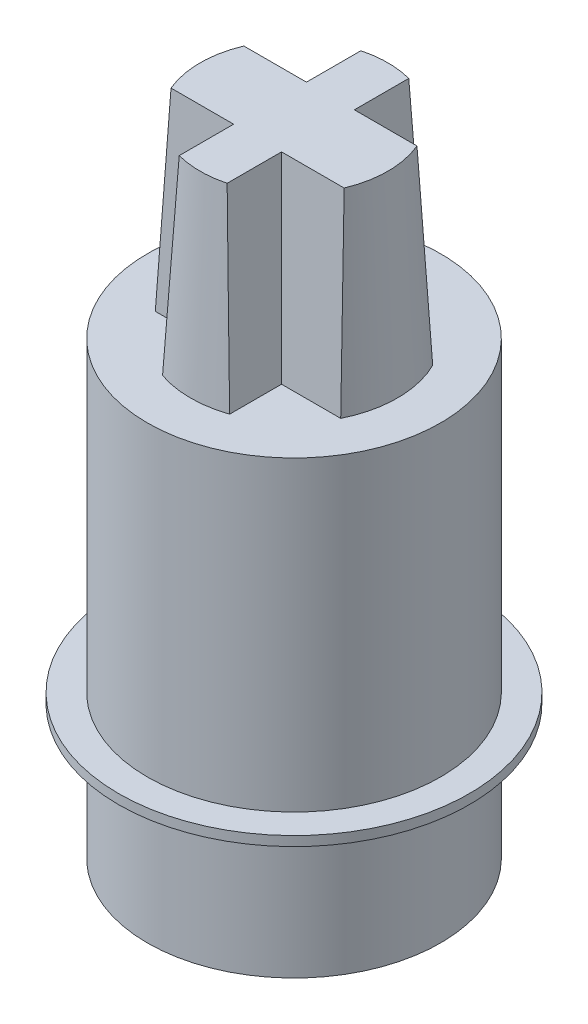
ISO-10303-21;
HEADER;
FILE_DESCRIPTION(('STEP AP214'),'2;1');
FILE_NAME('part.step','',(''),(''),'','','');
FILE_SCHEMA(('AUTOMOTIVE_DESIGN { 1 0 10303 214 1 1 1 1 }'));
ENDSEC;
DATA;
#1=APPLICATION_CONTEXT('core data for automotive mechanical design processes');
#2=APPLICATION_PROTOCOL_DEFINITION('international standard','automotive_design',2000,#1);
#3=PRODUCT_CONTEXT('',#1,'mechanical');
#4=PRODUCT('Part','Part','',(#3));
#5=PRODUCT_RELATED_PRODUCT_CATEGORY('part','',(#4));
#6=PRODUCT_DEFINITION_FORMATION('','',#4);
#7=PRODUCT_DEFINITION_CONTEXT('part definition',#1,'design');
#8=PRODUCT_DEFINITION('design','',#6,#7);
#9=PRODUCT_DEFINITION_SHAPE('','',#8);
#10=(LENGTH_UNIT() NAMED_UNIT(*) SI_UNIT(.MILLI.,.METRE.));
#11=(NAMED_UNIT(*) PLANE_ANGLE_UNIT() SI_UNIT($,.RADIAN.));
#12=(NAMED_UNIT(*) SI_UNIT($,.STERADIAN.) SOLID_ANGLE_UNIT());
#13=UNCERTAINTY_MEASURE_WITH_UNIT(LENGTH_MEASURE(1.E-05),#10,'distance_accuracy_value','');
#14=(GEOMETRIC_REPRESENTATION_CONTEXT(3) GLOBAL_UNCERTAINTY_ASSIGNED_CONTEXT((#13)) GLOBAL_UNIT_ASSIGNED_CONTEXT((#10,
#11,#12)) REPRESENTATION_CONTEXT('',''));
#15=CARTESIAN_POINT('',(0.,0.,0.));
#16=DIRECTION('',(0.,0.,1.));
#17=DIRECTION('',(1.,0.,0.));
#18=AXIS2_PLACEMENT_3D('',#15,#16,#17);
#19=CARTESIAN_POINT('',(0.,16.2556860872334,0.));
#20=DIRECTION('',(0.,1.,0.));
#21=DIRECTION('',(0.,0.,1.));
#22=AXIS2_PLACEMENT_3D('',#19,#20,#21);
#23=CYLINDRICAL_SURFACE('',#22,7.65);
#24=CARTESIAN_POINT('',(0.,7.5,0.));
#25=DIRECTION('',(0.,1.,0.));
#26=DIRECTION('',(0.,0.,1.));
#27=AXIS2_PLACEMENT_3D('',#24,#25,#26);
#28=CIRCLE('',#27,7.65);
#29=CARTESIAN_POINT('',(0.,7.5,7.65));
#30=VERTEX_POINT('',#29);
#31=EDGE_CURVE('E321',#30,#30,#28,.T.);
#32=ORIENTED_EDGE('',*,*,#31,.T.);
#33=EDGE_LOOP('',(#32));
#34=FACE_BOUND('',#33,.T.);
#35=CARTESIAN_POINT('',(0.,23.5,0.));
#36=DIRECTION('',(0.,1.,0.));
#37=DIRECTION('',(0.,0.,1.));
#38=AXIS2_PLACEMENT_3D('',#35,#36,#37);
#39=CIRCLE('',#38,7.65);
#40=CARTESIAN_POINT('',(0.,23.5,7.65));
#41=VERTEX_POINT('',#40);
#42=EDGE_CURVE('E318',#41,#41,#39,.T.);
#43=ORIENTED_EDGE('',*,*,#42,.F.);
#44=EDGE_LOOP('',(#43));
#45=FACE_BOUND('',#44,.T.);
#46=ADVANCED_FACE('F35',(#34,#45),#23,.T.);
#47=CARTESIAN_POINT('',(0.,0.,0.));
#48=DIRECTION('',(0.,1.,0.));
#49=DIRECTION('',(0.,0.,1.));
#50=AXIS2_PLACEMENT_3D('',#47,#48,#49);
#51=PLANE('',#50);
#52=CARTESIAN_POINT('',(0.,0.,0.));
#53=DIRECTION('',(0.,1.,0.));
#54=DIRECTION('',(0.,0.,1.));
#55=AXIS2_PLACEMENT_3D('',#52,#53,#54);
#56=CIRCLE('',#55,7.65);
#57=CARTESIAN_POINT('',(0.,0.,7.65));
#58=VERTEX_POINT('',#57);
#59=EDGE_CURVE('E278',#58,#58,#56,.T.);
#60=ORIENTED_EDGE('',*,*,#59,.F.);
#61=EDGE_LOOP('',(#60));
#62=FACE_BOUND('',#61,.T.);
#63=ADVANCED_FACE('F236',(#62),#51,.F.);
#64=CARTESIAN_POINT('',(0.,16.2556860872334,0.));
#65=DIRECTION('',(0.,1.,0.));
#66=DIRECTION('',(0.,0.,1.));
#67=AXIS2_PLACEMENT_3D('',#64,#65,#66);
#68=CYLINDRICAL_SURFACE('',#67,7.65);
#69=CARTESIAN_POINT('',(0.,7.,0.));
#70=DIRECTION('',(0.,1.,0.));
#71=DIRECTION('',(0.,0.,1.));
#72=AXIS2_PLACEMENT_3D('',#69,#70,#71);
#73=CIRCLE('',#72,7.65);
#74=CARTESIAN_POINT('',(0.,7.,7.65));
#75=VERTEX_POINT('',#74);
#76=EDGE_CURVE('E283',#75,#75,#73,.T.);
#77=ORIENTED_EDGE('',*,*,#76,.F.);
#78=EDGE_LOOP('',(#77));
#79=FACE_BOUND('',#78,.T.);
#80=ORIENTED_EDGE('',*,*,#59,.T.);
#81=EDGE_LOOP('',(#80));
#82=FACE_BOUND('',#81,.T.);
#83=ADVANCED_FACE('F242',(#79,#82),#68,.T.);
#84=CARTESIAN_POINT('',(7.65,7.,0.));
#85=DIRECTION('',(0.,1.,0.));
#86=DIRECTION('',(0.,0.,1.));
#87=AXIS2_PLACEMENT_3D('',#84,#85,#86);
#88=PLANE('',#87);
#89=CARTESIAN_POINT('',(0.,7.,0.));
#90=DIRECTION('',(0.,1.,0.));
#91=DIRECTION('',(0.,0.,1.));
#92=AXIS2_PLACEMENT_3D('',#89,#90,#91);
#93=CIRCLE('',#92,9.15);
#94=CARTESIAN_POINT('',(0.,7.,9.15));
#95=VERTEX_POINT('',#94);
#96=EDGE_CURVE('E326',#95,#95,#93,.T.);
#97=ORIENTED_EDGE('',*,*,#96,.F.);
#98=EDGE_LOOP('',(#97));
#99=FACE_BOUND('',#98,.T.);
#100=ORIENTED_EDGE('',*,*,#76,.T.);
#101=EDGE_LOOP('',(#100));
#102=FACE_BOUND('',#101,.T.);
#103=ADVANCED_FACE('F257',(#99,#102),#88,.F.);
#104=CARTESIAN_POINT('',(0.,16.2556860872334,0.));
#105=DIRECTION('',(0.,1.,0.));
#106=DIRECTION('',(0.,0.,1.));
#107=AXIS2_PLACEMENT_3D('',#104,#105,#106);
#108=CYLINDRICAL_SURFACE('',#107,9.15);
#109=CARTESIAN_POINT('',(0.,7.5,0.));
#110=DIRECTION('',(0.,1.,0.));
#111=DIRECTION('',(0.,0.,1.));
#112=AXIS2_PLACEMENT_3D('',#109,#110,#111);
#113=CIRCLE('',#112,9.15);
#114=CARTESIAN_POINT('',(0.,7.5,9.15));
#115=VERTEX_POINT('',#114);
#116=EDGE_CURVE('E323',#115,#115,#113,.T.);
#117=ORIENTED_EDGE('',*,*,#116,.F.);
#118=EDGE_LOOP('',(#117));
#119=FACE_BOUND('',#118,.T.);
#120=ORIENTED_EDGE('',*,*,#96,.T.);
#121=EDGE_LOOP('',(#120));
#122=FACE_BOUND('',#121,.T.);
#123=ADVANCED_FACE('F253',(#119,#122),#108,.T.);
#124=CARTESIAN_POINT('',(9.15,7.5,0.));
#125=DIRECTION('',(0.,-1.,0.));
#126=DIRECTION('',(0.,0.,-1.));
#127=AXIS2_PLACEMENT_3D('',#124,#125,#126);
#128=PLANE('',#127);
#129=ORIENTED_EDGE('',*,*,#31,.F.);
#130=EDGE_LOOP('',(#129));
#131=FACE_BOUND('',#130,.T.);
#132=ORIENTED_EDGE('',*,*,#116,.T.);
#133=EDGE_LOOP('',(#132));
#134=FACE_BOUND('',#133,.T.);
#135=ADVANCED_FACE('F250',(#131,#134),#128,.F.);
#136=CARTESIAN_POINT('',(0.,23.5,0.));
#137=DIRECTION('',(0.,1.,0.));
#138=DIRECTION('',(0.,0.,1.));
#139=AXIS2_PLACEMENT_3D('',#136,#137,#138);
#140=PLANE('',#139);
#141=DIRECTION('',(0.,0.,-1.));
#142=VECTOR('',#141,1.);
#143=CARTESIAN_POINT('',(-1.75,23.5,0.));
#144=LINE('',#143,#142);
#145=CARTESIAN_POINT('',(-1.75,23.5,-2.4));
#146=VERTEX_POINT('',#145);
#147=CARTESIAN_POINT('',(-1.75,23.5,-5.1085712288271));
#148=VERTEX_POINT('',#147);
#149=EDGE_CURVE('E130',#146,#148,#144,.T.);
#150=ORIENTED_EDGE('',*,*,#149,.T.);
#151=CARTESIAN_POINT('',(0.,23.5,0.));
#152=DIRECTION('',(0.,1.,0.));
#153=DIRECTION('',(0.,0.,1.));
#154=AXIS2_PLACEMENT_3D('',#151,#152,#153);
#155=CIRCLE('',#154,5.4);
#156=CARTESIAN_POINT('',(1.75,23.5,-5.1085712288271));
#157=VERTEX_POINT('',#156);
#158=EDGE_CURVE('E134',#157,#148,#155,.T.);
#159=ORIENTED_EDGE('',*,*,#158,.F.);
#160=DIRECTION('',(0.,0.,-1.));
#161=VECTOR('',#160,1.);
#162=CARTESIAN_POINT('',(1.75,23.5,0.));
#163=LINE('',#162,#161);
#164=CARTESIAN_POINT('',(1.75,23.5,-2.4));
#165=VERTEX_POINT('',#164);
#166=EDGE_CURVE('E150',#165,#157,#163,.T.);
#167=ORIENTED_EDGE('',*,*,#166,.F.);
#168=DIRECTION('',(1.,0.,0.));
#169=VECTOR('',#168,1.);
#170=CARTESIAN_POINT('',(0.,23.5,-2.4));
#171=LINE('',#170,#169);
#172=CARTESIAN_POINT('',(4.83735464897913,23.5,-2.4));
#173=VERTEX_POINT('',#172);
#174=EDGE_CURVE('E433',#165,#173,#171,.T.);
#175=ORIENTED_EDGE('',*,*,#174,.T.);
#176=CARTESIAN_POINT('',(4.83735464897913,23.5,2.4));
#177=VERTEX_POINT('',#176);
#178=EDGE_CURVE('E153',#177,#173,#155,.T.);
#179=ORIENTED_EDGE('',*,*,#178,.F.);
#180=DIRECTION('',(1.,0.,0.));
#181=VECTOR('',#180,1.);
#182=CARTESIAN_POINT('',(0.,23.5,2.4));
#183=LINE('',#182,#181);
#184=CARTESIAN_POINT('',(1.75,23.5,2.4));
#185=VERTEX_POINT('',#184);
#186=EDGE_CURVE('E437',#185,#177,#183,.T.);
#187=ORIENTED_EDGE('',*,*,#186,.F.);
#188=DIRECTION('',(0.,0.,1.));
#189=VECTOR('',#188,1.);
#190=CARTESIAN_POINT('',(1.75,23.5,0.));
#191=LINE('',#190,#189);
#192=CARTESIAN_POINT('',(1.75,23.5,5.1085712288271));
#193=VERTEX_POINT('',#192);
#194=EDGE_CURVE('E441',#185,#193,#191,.T.);
#195=ORIENTED_EDGE('',*,*,#194,.T.);
#196=CARTESIAN_POINT('',(-1.75,23.5,5.1085712288271));
#197=VERTEX_POINT('',#196);
#198=EDGE_CURVE('E313',#197,#193,#155,.T.);
#199=ORIENTED_EDGE('',*,*,#198,.F.);
#200=DIRECTION('',(0.,0.,1.));
#201=VECTOR('',#200,1.);
#202=CARTESIAN_POINT('',(-1.75,23.5,0.));
#203=LINE('',#202,#201);
#204=CARTESIAN_POINT('',(-1.75,23.5,2.4));
#205=VERTEX_POINT('',#204);
#206=EDGE_CURVE('E311',#205,#197,#203,.T.);
#207=ORIENTED_EDGE('',*,*,#206,.F.);
#208=DIRECTION('',(-1.,0.,0.));
#209=VECTOR('',#208,1.);
#210=CARTESIAN_POINT('',(0.,23.5,2.4));
#211=LINE('',#210,#209);
#212=CARTESIAN_POINT('',(-4.83735464897913,23.5,2.4));
#213=VERTEX_POINT('',#212);
#214=EDGE_CURVE('E309',#205,#213,#211,.T.);
#215=ORIENTED_EDGE('',*,*,#214,.T.);
#216=CARTESIAN_POINT('',(-4.83735464897913,23.5,-2.4));
#217=VERTEX_POINT('',#216);
#218=EDGE_CURVE('E152',#217,#213,#155,.T.);
#219=ORIENTED_EDGE('',*,*,#218,.F.);
#220=DIRECTION('',(-1.,0.,0.));
#221=VECTOR('',#220,1.);
#222=CARTESIAN_POINT('',(0.,23.5,-2.4));
#223=LINE('',#222,#221);
#224=EDGE_CURVE('E136',#146,#217,#223,.T.);
#225=ORIENTED_EDGE('',*,*,#224,.F.);
#226=EDGE_LOOP('',(#150,#159,#167,#175,#179,#187,#195,#199,#207,#215,#219,#225));
#227=FACE_BOUND('',#226,.T.);
#228=ORIENTED_EDGE('',*,*,#42,.T.);
#229=EDGE_LOOP('',(#228));
#230=FACE_BOUND('',#229,.T.);
#231=ADVANCED_FACE('F132',(#227,#230),#140,.T.);
#232=CARTESIAN_POINT('',(7.65,33.5,0.));
#233=DIRECTION('',(0.,-1.,0.));
#234=DIRECTION('',(0.,0.,-1.));
#235=AXIS2_PLACEMENT_3D('',#232,#233,#234);
#236=PLANE('',#235);
#237=DIRECTION('',(0.,0.,1.));
#238=VECTOR('',#237,1.);
#239=CARTESIAN_POINT('',(-1.25,33.5,0.));
#240=LINE('',#239,#238);
#241=CARTESIAN_POINT('',(-1.25,33.5,-4.73787927241714));
#242=VERTEX_POINT('',#241);
#243=CARTESIAN_POINT('',(-1.25,33.5,-1.9));
#244=VERTEX_POINT('',#243);
#245=EDGE_CURVE('E155',#242,#244,#240,.T.);
#246=ORIENTED_EDGE('',*,*,#245,.T.);
#247=DIRECTION('',(-1.,0.,0.));
#248=VECTOR('',#247,1.);
#249=CARTESIAN_POINT('',(-4.83735464897913,33.5,-1.9));
#250=LINE('',#249,#248);
#251=CARTESIAN_POINT('',(-4.5166359162545,33.5,-1.89999999999998));
#252=VERTEX_POINT('',#251);
#253=EDGE_CURVE('E11',#244,#252,#250,.T.);
#254=ORIENTED_EDGE('',*,*,#253,.T.);
#255=CARTESIAN_POINT('',(0.,33.5,0.));
#256=DIRECTION('',(0.,-1.,0.));
#257=DIRECTION('',(0.,0.,-1.));
#258=AXIS2_PLACEMENT_3D('',#255,#256,#257);
#259=CIRCLE('',#258,4.9);
#260=CARTESIAN_POINT('',(-4.5166359162545,33.5,1.9));
#261=VERTEX_POINT('',#260);
#262=EDGE_CURVE('E48',#252,#261,#259,.F.);
#263=ORIENTED_EDGE('',*,*,#262,.T.);
#264=DIRECTION('',(1.,0.,0.));
#265=VECTOR('',#264,1.);
#266=CARTESIAN_POINT('',(7.65,33.5,1.9));
#267=LINE('',#266,#265);
#268=CARTESIAN_POINT('',(-1.25,33.5,1.9));
#269=VERTEX_POINT('',#268);
#270=EDGE_CURVE('E300',#261,#269,#267,.T.);
#271=ORIENTED_EDGE('',*,*,#270,.T.);
#272=DIRECTION('',(0.,0.,1.));
#273=VECTOR('',#272,1.);
#274=CARTESIAN_POINT('',(-1.25,33.5,5.1085712288271));
#275=LINE('',#274,#273);
#276=CARTESIAN_POINT('',(-1.25,33.5,4.73787927241715));
#277=VERTEX_POINT('',#276);
#278=EDGE_CURVE('E298',#269,#277,#275,.T.);
#279=ORIENTED_EDGE('',*,*,#278,.T.);
#280=CARTESIAN_POINT('',(0.,33.5,0.));
#281=DIRECTION('',(0.,-1.,0.));
#282=DIRECTION('',(0.,0.,-1.));
#283=AXIS2_PLACEMENT_3D('',#280,#281,#282);
#284=CIRCLE('',#283,4.9);
#285=CARTESIAN_POINT('',(1.25,33.5,4.73787927241715));
#286=VERTEX_POINT('',#285);
#287=EDGE_CURVE('E296',#277,#286,#284,.F.);
#288=ORIENTED_EDGE('',*,*,#287,.T.);
#289=DIRECTION('',(0.,0.,-1.));
#290=VECTOR('',#289,1.);
#291=CARTESIAN_POINT('',(1.25,33.5,0.));
#292=LINE('',#291,#290);
#293=CARTESIAN_POINT('',(1.25,33.5,1.9));
#294=VERTEX_POINT('',#293);
#295=EDGE_CURVE('E294',#286,#294,#292,.T.);
#296=ORIENTED_EDGE('',*,*,#295,.T.);
#297=DIRECTION('',(1.,0.,0.));
#298=VECTOR('',#297,1.);
#299=CARTESIAN_POINT('',(4.83735464897913,33.5,1.9));
#300=LINE('',#299,#298);
#301=CARTESIAN_POINT('',(4.5166359162545,33.5,1.89999999999998));
#302=VERTEX_POINT('',#301);
#303=EDGE_CURVE('E292',#294,#302,#300,.T.);
#304=ORIENTED_EDGE('',*,*,#303,.T.);
#305=CARTESIAN_POINT('',(0.,33.5,0.));
#306=DIRECTION('',(0.,-1.,0.));
#307=DIRECTION('',(0.,0.,-1.));
#308=AXIS2_PLACEMENT_3D('',#305,#306,#307);
#309=CIRCLE('',#308,4.9);
#310=CARTESIAN_POINT('',(4.5166359162545,33.5,-1.9));
#311=VERTEX_POINT('',#310);
#312=EDGE_CURVE('E290',#302,#311,#309,.F.);
#313=ORIENTED_EDGE('',*,*,#312,.T.);
#314=DIRECTION('',(-1.,0.,0.));
#315=VECTOR('',#314,1.);
#316=CARTESIAN_POINT('',(7.65,33.5,-1.9));
#317=LINE('',#316,#315);
#318=CARTESIAN_POINT('',(1.25,33.5,-1.9));
#319=VERTEX_POINT('',#318);
#320=EDGE_CURVE('E288',#311,#319,#317,.T.);
#321=ORIENTED_EDGE('',*,*,#320,.T.);
#322=DIRECTION('',(0.,0.,-1.));
#323=VECTOR('',#322,1.);
#324=CARTESIAN_POINT('',(1.25,33.5,-5.1085712288271));
#325=LINE('',#324,#323);
#326=CARTESIAN_POINT('',(1.25,33.5,-4.73787927241714));
#327=VERTEX_POINT('',#326);
#328=EDGE_CURVE('E280',#319,#327,#325,.T.);
#329=ORIENTED_EDGE('',*,*,#328,.T.);
#330=CARTESIAN_POINT('',(0.,33.5,0.));
#331=DIRECTION('',(0.,-1.,0.));
#332=DIRECTION('',(0.,0.,-1.));
#333=AXIS2_PLACEMENT_3D('',#330,#331,#332);
#334=CIRCLE('',#333,4.9);
#335=EDGE_CURVE('E277',#327,#242,#334,.F.);
#336=ORIENTED_EDGE('',*,*,#335,.T.);
#337=EDGE_LOOP('',(#246,#254,#263,#271,#279,#288,#296,#304,#313,#321,#329,#336));
#338=FACE_BOUND('',#337,.T.);
#339=ADVANCED_FACE('F232',(#338),#236,.F.);
#340=CARTESIAN_POINT('',(7.65,33.5,1.9));
#341=DIRECTION('',(0.,0.0499376169438887,0.998752338877845));
#342=DIRECTION('',(-1.,0.,0.));
#343=AXIS2_PLACEMENT_3D('',#340,#341,#342);
#344=PLANE('',#343);
#345=DIRECTION('',(-0.0498754668053782,0.997509336107633,-0.0498754668053781));
#346=VECTOR('',#345,1.);
#347=CARTESIAN_POINT('',(1.74402985074627,23.6194029850739,2.39402985074627));
#348=LINE('',#347,#346);
#349=EDGE_CURVE('E224',#185,#294,#348,.T.);
#350=ORIENTED_EDGE('',*,*,#349,.F.);
#351=ORIENTED_EDGE('',*,*,#186,.T.);
#352=CARTESIAN_POINT('',(4.51663591625455,33.5,1.9));
#353=CARTESIAN_POINT('',(4.54430998110307,32.6666971988508,1.94166514005745));
#354=CARTESIAN_POINT('',(4.57173075098846,31.8333860222143,1.98333069888928));
#355=CARTESIAN_POINT('',(4.62609069966958,30.1667482488908,2.06666258755545));
#356=CARTESIAN_POINT('',(4.65302987861022,29.3334216522085,2.10832891738956));
#357=CARTESIAN_POINT('',(4.70645165987645,27.666753899003,2.19166230504983));
#358=CARTESIAN_POINT('',(4.7329342622189,26.8334127424802,2.23332936287597));
#359=CARTESIAN_POINT('',(4.78546489137329,25.1667165138303,2.31666417430845));
#360=CARTESIAN_POINT('',(4.81151291805448,24.3333614416991,2.35833192791501));
#361=CARTESIAN_POINT('',(4.83735464897927,23.4999999999993,2.4));
#362=B_SPLINE_CURVE_WITH_KNOTS('',3,(#352,#353,#354,#355,#356,#357,#358,#359,#360,#361),
.UNSPECIFIED.,.F.,.F.,(4,2,2,2,4),(0.,2.5044077664926,5.00881477939512,7.51322169980333,
10.0176293737164),.UNSPECIFIED.);
#363=EDGE_CURVE('E40',#302,#177,#362,.T.);
#364=ORIENTED_EDGE('',*,*,#363,.F.);
#365=ORIENTED_EDGE('',*,*,#303,.F.);
#366=EDGE_LOOP('',(#350,#351,#364,#365));
#367=FACE_BOUND('',#366,.T.);
#368=ADVANCED_FACE('F37',(#367),#344,.T.);
#369=CARTESIAN_POINT('',(0.,33.5,0.));
#370=DIRECTION('',(0.,-1.,0.));
#371=DIRECTION('',(0.,0.,-1.));
#372=AXIS2_PLACEMENT_3D('',#369,#370,#371);
#373=CONICAL_SURFACE('',#372,4.9,0.0499583957219392);
#374=ORIENTED_EDGE('',*,*,#363,.T.);
#375=ORIENTED_EDGE('',*,*,#178,.T.);
#376=CARTESIAN_POINT('',(4.5166359162545,33.5,-1.89999999999998));
#377=CARTESIAN_POINT('',(4.54430998110306,32.6666971988508,-1.94166514005745));
#378=CARTESIAN_POINT('',(4.57173075098845,31.8333860222143,-1.98333069888928));
#379=CARTESIAN_POINT('',(4.62609069966958,30.1667482488908,-2.06666258755545));
#380=CARTESIAN_POINT('',(4.65302987861022,29.3334216522085,-2.10832891738956));
#381=CARTESIAN_POINT('',(4.70645165987645,27.666753899003,-2.19166230504983));
#382=CARTESIAN_POINT('',(4.7329342622189,26.8334127424802,-2.23332936287597));
#383=CARTESIAN_POINT('',(4.78546489137329,25.1667165138303,-2.31666417430845));
#384=CARTESIAN_POINT('',(4.81151291805448,24.3333614416991,-2.35833192791501));
#385=CARTESIAN_POINT('',(4.83735464897927,23.4999999999993,-2.4));
#386=B_SPLINE_CURVE_WITH_KNOTS('',3,(#376,#377,#378,#379,#380,#381,#382,#383,#384,#385),
.UNSPECIFIED.,.F.,.F.,(4,2,2,2,4),(0.,2.5044077664926,5.00881477939512,7.51322169980332,
10.0176293737164),.UNSPECIFIED.);
#387=EDGE_CURVE('E219',#311,#173,#386,.T.);
#388=ORIENTED_EDGE('',*,*,#387,.F.);
#389=ORIENTED_EDGE('',*,*,#312,.F.);
#390=EDGE_LOOP('',(#374,#375,#388,#389));
#391=FACE_BOUND('',#390,.T.);
#392=ADVANCED_FACE('F210',(#391),#373,.T.);
#393=CARTESIAN_POINT('',(1.75,23.4999999999993,0.));
#394=DIRECTION('',(-0.998752338877845,-0.0499376169438888,0.));
#395=DIRECTION('',(0.,0.,1.));
#396=AXIS2_PLACEMENT_3D('',#393,#394,#395);
#397=PLANE('',#396);
#398=ORIENTED_EDGE('',*,*,#349,.T.);
#399=ORIENTED_EDGE('',*,*,#295,.F.);
#400=CARTESIAN_POINT('',(1.25,33.5,4.73787927241715));
#401=CARTESIAN_POINT('',(1.29166441886479,32.6667116227041,4.76997639523113));
#402=CARTESIAN_POINT('',(1.33332945973511,31.8334108052977,4.80174902538771));
#403=CARTESIAN_POINT('',(1.41666067777882,30.1667864444235,4.86468030547011));
#404=CARTESIAN_POINT('',(1.45832685495165,29.3334629009668,4.89583895569328));
#405=CARTESIAN_POINT('',(1.5416602757215,27.6667944855695,4.95757731014204));
#406=CARTESIAN_POINT('',(1.58332751931847,26.8334496136302,4.98815701440275));
#407=CARTESIAN_POINT('',(1.66666302174858,25.1667395650278,5.04876790812508));
#408=CARTESIAN_POINT('',(1.70833128058222,24.3333743883551,5.07879909732108));
#409=CARTESIAN_POINT('',(1.75,23.4999999999993,5.10857122882715));
#410=B_SPLINE_CURVE_WITH_KNOTS('',3,(#400,#401,#402,#403,#404,#405,#406,#407,#408,#409),
.UNSPECIFIED.,.F.,.F.,(4,2,2,2,4),(0.,2.50483941654276,5.00967761999205,7.51451567151499,
10.019354935959),.UNSPECIFIED.);
#411=EDGE_CURVE('E213',#193,#286,#410,.F.);
#412=ORIENTED_EDGE('',*,*,#411,.F.);
#413=ORIENTED_EDGE('',*,*,#194,.F.);
#414=EDGE_LOOP('',(#398,#399,#412,#413));
#415=FACE_BOUND('',#414,.T.);
#416=ADVANCED_FACE('F205',(#415),#397,.F.);
#417=CARTESIAN_POINT('',(0.,23.4999999999993,-2.4));
#418=DIRECTION('',(0.,-0.0499376169438887,0.998752338877845));
#419=DIRECTION('',(1.,0.,0.));
#420=AXIS2_PLACEMENT_3D('',#417,#418,#419);
#421=PLANE('',#420);
#422=ORIENTED_EDGE('',*,*,#387,.T.);
#423=ORIENTED_EDGE('',*,*,#174,.F.);
#424=DIRECTION('',(-0.0498754668053782,0.997509336107633,0.0498754668053781));
#425=VECTOR('',#424,1.);
#426=CARTESIAN_POINT('',(1.74564676616916,23.5870646766162,-2.39564676616915));
#427=LINE('',#426,#425);
#428=EDGE_CURVE('E197',#319,#165,#427,.F.);
#429=ORIENTED_EDGE('',*,*,#428,.F.);
#430=ORIENTED_EDGE('',*,*,#320,.F.);
#431=EDGE_LOOP('',(#422,#423,#429,#430));
#432=FACE_BOUND('',#431,.T.);
#433=ADVANCED_FACE('F209',(#432),#421,.F.);
#434=CARTESIAN_POINT('',(0.,33.5,0.));
#435=DIRECTION('',(0.,-1.,0.));
#436=DIRECTION('',(0.,0.,-1.));
#437=AXIS2_PLACEMENT_3D('',#434,#435,#436);
#438=CONICAL_SURFACE('',#437,4.9,0.0499583957219392);
#439=ORIENTED_EDGE('',*,*,#411,.T.);
#440=ORIENTED_EDGE('',*,*,#287,.F.);
#441=CARTESIAN_POINT('',(-1.25,33.5,4.73787927241716));
#442=CARTESIAN_POINT('',(-1.29166441886479,32.6667116227041,4.76997639523113));
#443=CARTESIAN_POINT('',(-1.33332945973511,31.8334108052977,4.80174902538771));
#444=CARTESIAN_POINT('',(-1.41666067777882,30.1667864444235,4.86468030547011));
#445=CARTESIAN_POINT('',(-1.45832685495165,29.3334629009668,4.89583895569328));
#446=CARTESIAN_POINT('',(-1.5416602757215,27.6667944855695,4.95757731014204));
#447=CARTESIAN_POINT('',(-1.58332751931846,26.8334496136302,4.98815701440275));
#448=CARTESIAN_POINT('',(-1.66666302174858,25.1667395650278,5.04876790812508));
#449=CARTESIAN_POINT('',(-1.70833128058221,24.3333743883551,5.07879909732108));
#450=CARTESIAN_POINT('',(-1.75,23.4999999999993,5.10857122882715));
#451=B_SPLINE_CURVE_WITH_KNOTS('',3,(#441,#442,#443,#444,#445,#446,#447,#448,#449,#450),
.UNSPECIFIED.,.F.,.F.,(4,2,2,2,4),(0.,2.50483941654275,5.00967761999206,7.51451567151499,
10.019354935959),.UNSPECIFIED.);
#452=EDGE_CURVE('E190',#197,#277,#451,.F.);
#453=ORIENTED_EDGE('',*,*,#452,.F.);
#454=ORIENTED_EDGE('',*,*,#198,.T.);
#455=EDGE_LOOP('',(#439,#440,#453,#454));
#456=FACE_BOUND('',#455,.T.);
#457=ADVANCED_FACE('F199',(#456),#438,.T.);
#458=CARTESIAN_POINT('',(1.25,33.5,0.));
#459=DIRECTION('',(0.998752338877845,0.0499376169438888,0.));
#460=DIRECTION('',(0.,0.,1.));
#461=AXIS2_PLACEMENT_3D('',#458,#459,#460);
#462=PLANE('',#461);
#463=ORIENTED_EDGE('',*,*,#428,.T.);
#464=ORIENTED_EDGE('',*,*,#166,.T.);
#465=CARTESIAN_POINT('',(1.25,33.5,-4.73787927241715));
#466=CARTESIAN_POINT('',(1.29166441886479,32.6667116227041,-4.76997639523113));
#467=CARTESIAN_POINT('',(1.33332945973511,31.8334108052977,-4.80174902538771));
#468=CARTESIAN_POINT('',(1.41666067777882,30.1667864444235,-4.86468030547011));
#469=CARTESIAN_POINT('',(1.45832685495165,29.3334629009668,-4.89583895569328));
#470=CARTESIAN_POINT('',(1.5416602757215,27.6667944855695,-4.95757731014204));
#471=CARTESIAN_POINT('',(1.58332751931847,26.8334496136302,-4.98815701440275));
#472=CARTESIAN_POINT('',(1.66666302174858,25.1667395650278,-5.04876790812508));
#473=CARTESIAN_POINT('',(1.70833128058222,24.3333743883551,-5.07879909732108));
#474=CARTESIAN_POINT('',(1.75,23.4999999999993,-5.10857122882715));
#475=B_SPLINE_CURVE_WITH_KNOTS('',3,(#465,#466,#467,#468,#469,#470,#471,#472,#473,#474),
.UNSPECIFIED.,.F.,.F.,(4,2,2,2,4),(0.,2.50483941654276,5.00967761999206,7.51451567151499,
10.019354935959),.UNSPECIFIED.);
#476=EDGE_CURVE('E149',#327,#157,#475,.T.);
#477=ORIENTED_EDGE('',*,*,#476,.F.);
#478=ORIENTED_EDGE('',*,*,#328,.F.);
#479=EDGE_LOOP('',(#463,#464,#477,#478));
#480=FACE_BOUND('',#479,.T.);
#481=ADVANCED_FACE('F182',(#480),#462,.T.);
#482=CARTESIAN_POINT('',(-1.25,33.5,0.));
#483=DIRECTION('',(-0.998752338877845,0.0499376169438887,0.));
#484=DIRECTION('',(0.,0.,-1.));
#485=AXIS2_PLACEMENT_3D('',#482,#483,#484);
#486=PLANE('',#485);
#487=ORIENTED_EDGE('',*,*,#452,.T.);
#488=ORIENTED_EDGE('',*,*,#278,.F.);
#489=DIRECTION('',(0.0498754668053781,0.997509336107633,-0.0498754668053782));
#490=VECTOR('',#489,1.);
#491=CARTESIAN_POINT('',(-1.74564676616915,23.5870646766162,2.39564676616915));
#492=LINE('',#491,#490);
#493=EDGE_CURVE('E156',#205,#269,#492,.T.);
#494=ORIENTED_EDGE('',*,*,#493,.F.);
#495=ORIENTED_EDGE('',*,*,#206,.T.);
#496=EDGE_LOOP('',(#487,#488,#494,#495));
#497=FACE_BOUND('',#496,.T.);
#498=ADVANCED_FACE('F181',(#497),#486,.T.);
#499=CARTESIAN_POINT('',(0.,33.5,0.));
#500=DIRECTION('',(0.,-1.,0.));
#501=DIRECTION('',(0.,0.,-1.));
#502=AXIS2_PLACEMENT_3D('',#499,#500,#501);
#503=CONICAL_SURFACE('',#502,4.9,0.0499583957219392);
#504=ORIENTED_EDGE('',*,*,#476,.T.);
#505=ORIENTED_EDGE('',*,*,#158,.T.);
#506=CARTESIAN_POINT('',(-1.25,33.5,-4.73787927241714));
#507=CARTESIAN_POINT('',(-1.29166441886479,32.6667116227041,-4.76997639523113));
#508=CARTESIAN_POINT('',(-1.33332945973511,31.8334108052977,-4.80174902538771));
#509=CARTESIAN_POINT('',(-1.41666067777882,30.1667864444235,-4.86468030547011));
#510=CARTESIAN_POINT('',(-1.45832685495165,29.3334629009668,-4.89583895569328));
#511=CARTESIAN_POINT('',(-1.5416602757215,27.6667944855695,-4.95757731014204));
#512=CARTESIAN_POINT('',(-1.58332751931847,26.8334496136302,-4.98815701440275));
#513=CARTESIAN_POINT('',(-1.66666302174858,25.1667395650278,-5.04876790812508));
#514=CARTESIAN_POINT('',(-1.70833128058222,24.3333743883551,-5.07879909732108));
#515=CARTESIAN_POINT('',(-1.75,23.4999999999993,-5.10857122882715));
#516=B_SPLINE_CURVE_WITH_KNOTS('',3,(#506,#507,#508,#509,#510,#511,#512,#513,#514,#515),
.UNSPECIFIED.,.F.,.F.,(4,2,2,2,4),(0.,2.50483941654275,5.00967761999206,7.51451567151499,
10.019354935959),.UNSPECIFIED.);
#517=EDGE_CURVE('E146',#242,#148,#516,.T.);
#518=ORIENTED_EDGE('',*,*,#517,.F.);
#519=ORIENTED_EDGE('',*,*,#335,.F.);
#520=EDGE_LOOP('',(#504,#505,#518,#519));
#521=FACE_BOUND('',#520,.T.);
#522=ADVANCED_FACE('F144',(#521),#503,.T.);
#523=CARTESIAN_POINT('',(0.,23.4999999999993,2.4));
#524=DIRECTION('',(0.,-0.0499376169438887,-0.998752338877845));
#525=DIRECTION('',(-1.,0.,0.));
#526=AXIS2_PLACEMENT_3D('',#523,#524,#525);
#527=PLANE('',#526);
#528=ORIENTED_EDGE('',*,*,#493,.T.);
#529=ORIENTED_EDGE('',*,*,#270,.F.);
#530=CARTESIAN_POINT('',(-4.5166359162545,33.5,1.89999999999998));
#531=CARTESIAN_POINT('',(-4.54430998110306,32.6666971988508,1.94166514005745));
#532=CARTESIAN_POINT('',(-4.57173075098845,31.8333860222143,1.98333069888928));
#533=CARTESIAN_POINT('',(-4.62609069966958,30.1667482488908,2.06666258755545));
#534=CARTESIAN_POINT('',(-4.65302987861022,29.3334216522085,2.10832891738956));
#535=CARTESIAN_POINT('',(-4.70645165987645,27.666753899003,2.19166230504983));
#536=CARTESIAN_POINT('',(-4.7329342622189,26.8334127424802,2.23332936287597));
#537=CARTESIAN_POINT('',(-4.78546489137329,25.1667165138303,2.31666417430846));
#538=CARTESIAN_POINT('',(-4.81151291805448,24.3333614416991,2.35833192791501));
#539=CARTESIAN_POINT('',(-4.83735464897927,23.4999999999993,2.4));
#540=B_SPLINE_CURVE_WITH_KNOTS('',3,(#530,#531,#532,#533,#534,#535,#536,#537,#538,#539),
.UNSPECIFIED.,.F.,.F.,(4,2,2,2,4),(0.,2.5044077664926,5.00881477939512,7.51322169980332,
10.0176293737164),.UNSPECIFIED.);
#541=EDGE_CURVE('E157',#213,#261,#540,.F.);
#542=ORIENTED_EDGE('',*,*,#541,.F.);
#543=ORIENTED_EDGE('',*,*,#214,.F.);
#544=EDGE_LOOP('',(#528,#529,#542,#543));
#545=FACE_BOUND('',#544,.T.);
#546=ADVANCED_FACE('F180',(#545),#527,.F.);
#547=CARTESIAN_POINT('',(-1.75,23.4999999999993,0.));
#548=DIRECTION('',(0.998752338877845,-0.0499376169438887,0.));
#549=DIRECTION('',(0.,0.,-1.));
#550=AXIS2_PLACEMENT_3D('',#547,#548,#549);
#551=PLANE('',#550);
#552=ORIENTED_EDGE('',*,*,#517,.T.);
#553=ORIENTED_EDGE('',*,*,#149,.F.);
#554=DIRECTION('',(-0.0498754668053781,-0.997509336107633,-0.0498754668053781));
#555=VECTOR('',#554,1.);
#556=CARTESIAN_POINT('',(-1.22786069651742,33.9427860696517,-1.87786069651742));
#557=LINE('',#556,#555);
#558=EDGE_CURVE('E162',#244,#146,#557,.T.);
#559=ORIENTED_EDGE('',*,*,#558,.F.);
#560=ORIENTED_EDGE('',*,*,#245,.F.);
#561=EDGE_LOOP('',(#552,#553,#559,#560));
#562=FACE_BOUND('',#561,.T.);
#563=ADVANCED_FACE('F154',(#562),#551,.F.);
#564=CARTESIAN_POINT('',(0.,33.5,0.));
#565=DIRECTION('',(0.,-1.,0.));
#566=DIRECTION('',(0.,0.,-1.));
#567=AXIS2_PLACEMENT_3D('',#564,#565,#566);
#568=CONICAL_SURFACE('',#567,4.9,0.0499583957219392);
#569=ORIENTED_EDGE('',*,*,#541,.T.);
#570=ORIENTED_EDGE('',*,*,#262,.F.);
#571=CARTESIAN_POINT('',(-4.51663591625455,33.5,-1.9));
#572=CARTESIAN_POINT('',(-4.54430998110308,32.6666971988508,-1.94166514005745));
#573=CARTESIAN_POINT('',(-4.57173075098846,31.8333860222143,-1.98333069888928));
#574=CARTESIAN_POINT('',(-4.62609069966958,30.1667482488908,-2.06666258755545));
#575=CARTESIAN_POINT('',(-4.65302987861022,29.3334216522085,-2.10832891738956));
#576=CARTESIAN_POINT('',(-4.70645165987645,27.666753899003,-2.19166230504983));
#577=CARTESIAN_POINT('',(-4.7329342622189,26.8334127424802,-2.23332936287597));
#578=CARTESIAN_POINT('',(-4.78546489137329,25.1667165138303,-2.31666417430845));
#579=CARTESIAN_POINT('',(-4.81151291805448,24.3333614416991,-2.35833192791501));
#580=CARTESIAN_POINT('',(-4.83735464897928,23.4999999999993,-2.4));
#581=B_SPLINE_CURVE_WITH_KNOTS('',3,(#571,#572,#573,#574,#575,#576,#577,#578,#579,#580),
.UNSPECIFIED.,.F.,.F.,(4,2,2,2,4),(0.,2.5044077664926,5.00881477939512,7.51322169980333,
10.0176293737164),.UNSPECIFIED.);
#582=EDGE_CURVE('E56',#217,#252,#581,.F.);
#583=ORIENTED_EDGE('',*,*,#582,.F.);
#584=ORIENTED_EDGE('',*,*,#218,.T.);
#585=EDGE_LOOP('',(#569,#570,#583,#584));
#586=FACE_BOUND('',#585,.T.);
#587=ADVANCED_FACE('F264',(#586),#568,.T.);
#588=CARTESIAN_POINT('',(7.65,33.5,-1.90000000000001));
#589=DIRECTION('',(0.,0.0499376169438887,-0.998752338877845));
#590=DIRECTION('',(1.,0.,0.));
#591=AXIS2_PLACEMENT_3D('',#588,#589,#590);
#592=PLANE('',#591);
#593=ORIENTED_EDGE('',*,*,#558,.T.);
#594=ORIENTED_EDGE('',*,*,#224,.T.);
#595=ORIENTED_EDGE('',*,*,#582,.T.);
#596=ORIENTED_EDGE('',*,*,#253,.F.);
#597=EDGE_LOOP('',(#593,#594,#595,#596));
#598=FACE_BOUND('',#597,.T.);
#599=ADVANCED_FACE('F268',(#598),#592,.T.);
#600=CLOSED_SHELL('',(#46,#63,#83,#103,#123,#135,#231,#339,#368,#392,#416,#433,#457,#481,#498,
#522,#546,#563,#587,#599));
#601=MANIFOLD_SOLID_BREP('B2',#600);
#602=ADVANCED_BREP_SHAPE_REPRESENTATION('',(#18,#601),#14);
#603=SHAPE_DEFINITION_REPRESENTATION(#9,#602);
ENDSEC;
END-ISO-10303-21;
